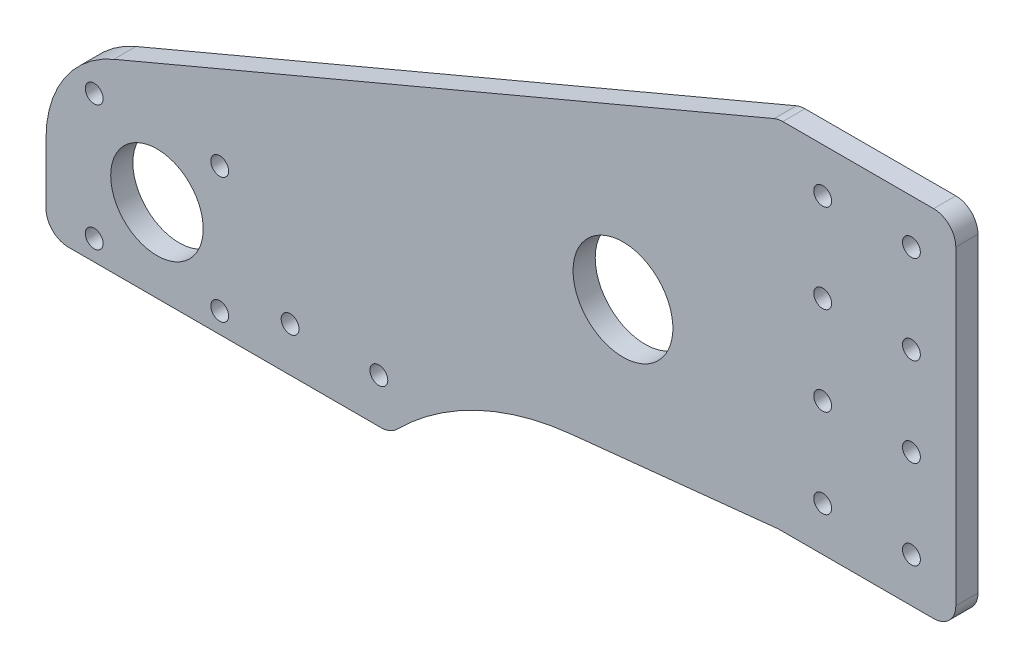
ISO-10303-21;
HEADER;
FILE_DESCRIPTION(('STEP AP214'),'2;1');
FILE_NAME('part.step','',(''),(''),'','','');
FILE_SCHEMA(('AUTOMOTIVE_DESIGN { 1 0 10303 214 1 1 1 1 }'));
ENDSEC;
DATA;
#1=APPLICATION_CONTEXT('core data for automotive mechanical design processes');
#2=APPLICATION_PROTOCOL_DEFINITION('international standard','automotive_design',2000,#1);
#3=PRODUCT_CONTEXT('',#1,'mechanical');
#4=PRODUCT('Part','Part','',(#3));
#5=PRODUCT_RELATED_PRODUCT_CATEGORY('part','',(#4));
#6=PRODUCT_DEFINITION_FORMATION('','',#4);
#7=PRODUCT_DEFINITION_CONTEXT('part definition',#1,'design');
#8=PRODUCT_DEFINITION('design','',#6,#7);
#9=PRODUCT_DEFINITION_SHAPE('','',#8);
#10=(LENGTH_UNIT() NAMED_UNIT(*) SI_UNIT(.MILLI.,.METRE.));
#11=(NAMED_UNIT(*) PLANE_ANGLE_UNIT() SI_UNIT($,.RADIAN.));
#12=(NAMED_UNIT(*) SI_UNIT($,.STERADIAN.) SOLID_ANGLE_UNIT());
#13=UNCERTAINTY_MEASURE_WITH_UNIT(LENGTH_MEASURE(1.E-05),#10,'distance_accuracy_value','');
#14=(GEOMETRIC_REPRESENTATION_CONTEXT(3) GLOBAL_UNCERTAINTY_ASSIGNED_CONTEXT((#13)) GLOBAL_UNIT_ASSIGNED_CONTEXT((#10,
#11,#12)) REPRESENTATION_CONTEXT('',''));
#15=CARTESIAN_POINT('',(0.,0.,0.));
#16=DIRECTION('',(0.,0.,1.));
#17=DIRECTION('',(1.,0.,0.));
#18=AXIS2_PLACEMENT_3D('',#15,#16,#17);
#19=CARTESIAN_POINT('',(-50.7999999999977,44.450000000004,-6.35));
#20=DIRECTION('',(0.,0.,1.));
#21=DIRECTION('',(1.,0.,0.));
#22=AXIS2_PLACEMENT_3D('',#19,#20,#21);
#23=CYLINDRICAL_SURFACE('',#22,6.35);
#24=CARTESIAN_POINT('',(-50.7999999999977,44.450000000004,-6.35));
#25=DIRECTION('',(0.,0.,-1.));
#26=DIRECTION('',(-1.,0.,0.));
#27=AXIS2_PLACEMENT_3D('',#24,#25,#26);
#28=CIRCLE('',#27,6.35);
#29=CARTESIAN_POINT('',(-50.7999999999977,38.100000000004,-6.35));
#30=VERTEX_POINT('',#29);
#31=CARTESIAN_POINT('',(-57.1499999999977,44.450000000004,-6.35));
#32=VERTEX_POINT('',#31);
#33=EDGE_CURVE('E273',#30,#32,#28,.T.);
#34=ORIENTED_EDGE('',*,*,#33,.F.);
#35=DIRECTION('',(0.,0.,-1.));
#36=VECTOR('',#35,1.);
#37=CARTESIAN_POINT('',(-50.7999999999977,38.100000000004,-6.35));
#38=LINE('',#37,#36);
#39=CARTESIAN_POINT('',(-50.7999999999977,38.100000000004,0.));
#40=VERTEX_POINT('',#39);
#41=EDGE_CURVE('E403',#40,#30,#38,.T.);
#42=ORIENTED_EDGE('',*,*,#41,.F.);
#43=CARTESIAN_POINT('',(-50.7999999999977,44.450000000004,0.));
#44=DIRECTION('',(0.,0.,1.));
#45=DIRECTION('',(-1.,0.,0.));
#46=AXIS2_PLACEMENT_3D('',#43,#44,#45);
#47=CIRCLE('',#46,6.35);
#48=CARTESIAN_POINT('',(-57.1499999999977,44.450000000004,0.));
#49=VERTEX_POINT('',#48);
#50=EDGE_CURVE('E291',#49,#40,#47,.T.);
#51=ORIENTED_EDGE('',*,*,#50,.F.);
#52=DIRECTION('',(0.,0.,1.));
#53=VECTOR('',#52,1.);
#54=CARTESIAN_POINT('',(-57.1499999999977,44.450000000004,-6.35));
#55=LINE('',#54,#53);
#56=EDGE_CURVE('E406',#32,#49,#55,.T.);
#57=ORIENTED_EDGE('',*,*,#56,.F.);
#58=EDGE_LOOP('',(#34,#42,#51,#57));
#59=FACE_BOUND('',#58,.T.);
#60=ADVANCED_FACE('F17',(#59),#23,.T.);
#61=CARTESIAN_POINT('',(38.7414144686771,44.4500000000039,-6.35));
#62=DIRECTION('',(0.,0.,1.));
#63=DIRECTION('',(1.,0.,0.));
#64=AXIS2_PLACEMENT_3D('',#61,#62,#63);
#65=CYLINDRICAL_SURFACE('',#64,6.35);
#66=CARTESIAN_POINT('',(38.7414144686771,44.4500000000039,-6.35));
#67=DIRECTION('',(0.,0.,-1.));
#68=DIRECTION('',(-1.,0.,0.));
#69=AXIS2_PLACEMENT_3D('',#66,#67,#68);
#70=CIRCLE('',#69,6.35);
#71=CARTESIAN_POINT('',(43.2313134352007,39.9596428571464,-6.35));
#72=VERTEX_POINT('',#71);
#73=CARTESIAN_POINT('',(38.7414144686771,38.1000000000039,-6.35));
#74=VERTEX_POINT('',#73);
#75=EDGE_CURVE('E269',#72,#74,#70,.T.);
#76=ORIENTED_EDGE('',*,*,#75,.F.);
#77=DIRECTION('',(0.,0.,-1.));
#78=VECTOR('',#77,1.);
#79=CARTESIAN_POINT('',(43.2313134352007,39.9596428571464,-6.35));
#80=LINE('',#79,#78);
#81=CARTESIAN_POINT('',(43.2313134352007,39.9596428571464,0.));
#82=VERTEX_POINT('',#81);
#83=EDGE_CURVE('E468',#82,#72,#80,.T.);
#84=ORIENTED_EDGE('',*,*,#83,.F.);
#85=CARTESIAN_POINT('',(38.7414144686771,44.4500000000039,0.));
#86=DIRECTION('',(0.,0.,1.));
#87=DIRECTION('',(-1.,0.,0.));
#88=AXIS2_PLACEMENT_3D('',#85,#86,#87);
#89=CIRCLE('',#88,6.35);
#90=CARTESIAN_POINT('',(38.7414144686771,38.1000000000039,0.));
#91=VERTEX_POINT('',#90);
#92=EDGE_CURVE('E298',#91,#82,#89,.T.);
#93=ORIENTED_EDGE('',*,*,#92,.F.);
#94=DIRECTION('',(0.,0.,1.));
#95=VECTOR('',#94,1.);
#96=CARTESIAN_POINT('',(38.7414144686771,38.1000000000039,0.));
#97=LINE('',#96,#95);
#98=EDGE_CURVE('E431',#74,#91,#97,.T.);
#99=ORIENTED_EDGE('',*,*,#98,.F.);
#100=EDGE_LOOP('',(#76,#84,#93,#99));
#101=FACE_BOUND('',#100,.T.);
#102=ADVANCED_FACE('F389',(#101),#65,.T.);
#103=CARTESIAN_POINT('',(152.728599018071,63.5,-6.35));
#104=DIRECTION('',(0.,0.,-1.));
#105=DIRECTION('',(-1.,0.,0.));
#106=AXIS2_PLACEMENT_3D('',#103,#104,#105);
#107=CYLINDRICAL_SURFACE('',#106,6.35);
#108=CARTESIAN_POINT('',(152.728599018071,63.5,-6.35));
#109=DIRECTION('',(0.,0.,1.));
#110=DIRECTION('',(-1.,0.,0.));
#111=AXIS2_PLACEMENT_3D('',#108,#109,#110);
#112=CIRCLE('',#111,6.35);
#113=CARTESIAN_POINT('',(152.728599018071,69.85,-6.35));
#114=VERTEX_POINT('',#113);
#115=CARTESIAN_POINT('',(152.073156154869,69.8160822234262,-6.35));
#116=VERTEX_POINT('',#115);
#117=EDGE_CURVE('E274',#114,#116,#112,.T.);
#118=ORIENTED_EDGE('',*,*,#117,.F.);
#119=DIRECTION('',(0.,0.,-1.));
#120=VECTOR('',#119,1.);
#121=CARTESIAN_POINT('',(152.728599018071,69.85,-6.35));
#122=LINE('',#121,#120);
#123=CARTESIAN_POINT('',(152.728599018071,69.85,0.));
#124=VERTEX_POINT('',#123);
#125=EDGE_CURVE('E527',#124,#114,#122,.T.);
#126=ORIENTED_EDGE('',*,*,#125,.F.);
#127=CARTESIAN_POINT('',(152.728599018071,63.5,0.));
#128=DIRECTION('',(0.,0.,-1.));
#129=DIRECTION('',(-1.,0.,0.));
#130=AXIS2_PLACEMENT_3D('',#127,#128,#129);
#131=CIRCLE('',#130,6.35);
#132=CARTESIAN_POINT('',(152.073156154869,69.8160822234262,0.));
#133=VERTEX_POINT('',#132);
#134=EDGE_CURVE('E20',#133,#124,#131,.T.);
#135=ORIENTED_EDGE('',*,*,#134,.F.);
#136=DIRECTION('',(0.,0.,1.));
#137=VECTOR('',#136,1.);
#138=CARTESIAN_POINT('',(152.073156154869,69.8160822234262,0.));
#139=LINE('',#138,#137);
#140=EDGE_CURVE('E438',#116,#133,#139,.T.);
#141=ORIENTED_EDGE('',*,*,#140,.F.);
#142=EDGE_LOOP('',(#118,#126,#135,#141));
#143=FACE_BOUND('',#142,.T.);
#144=ADVANCED_FACE('F394',(#143),#107,.F.);
#145=CARTESIAN_POINT('',(153.685641644431,165.1,-6.35));
#146=DIRECTION('',(0.,0.,1.));
#147=DIRECTION('',(1.,0.,0.));
#148=AXIS2_PLACEMENT_3D('',#145,#146,#147);
#149=CYLINDRICAL_SURFACE('',#148,6.35);
#150=CARTESIAN_POINT('',(153.685641644431,165.1,-6.35));
#151=DIRECTION('',(0.,0.,-1.));
#152=DIRECTION('',(-1.,0.,0.));
#153=AXIS2_PLACEMENT_3D('',#150,#151,#152);
#154=CIRCLE('',#153,6.35);
#155=CARTESIAN_POINT('',(151.215608397485,170.949909038522,-6.35));
#156=VERTEX_POINT('',#155);
#157=CARTESIAN_POINT('',(153.685641644431,171.45,-6.35));
#158=VERTEX_POINT('',#157);
#159=EDGE_CURVE('E278',#156,#158,#154,.T.);
#160=ORIENTED_EDGE('',*,*,#159,.F.);
#161=DIRECTION('',(0.,0.,-1.));
#162=VECTOR('',#161,1.);
#163=CARTESIAN_POINT('',(151.215608397485,170.949909038522,-6.35));
#164=LINE('',#163,#162);
#165=CARTESIAN_POINT('',(151.215608397485,170.949909038522,0.));
#166=VERTEX_POINT('',#165);
#167=EDGE_CURVE('E477',#166,#156,#164,.T.);
#168=ORIENTED_EDGE('',*,*,#167,.F.);
#169=CARTESIAN_POINT('',(153.685641644431,165.1,0.));
#170=DIRECTION('',(0.,0.,1.));
#171=DIRECTION('',(-1.,0.,0.));
#172=AXIS2_PLACEMENT_3D('',#169,#170,#171);
#173=CIRCLE('',#172,6.35);
#174=CARTESIAN_POINT('',(153.685641644431,171.45,0.));
#175=VERTEX_POINT('',#174);
#176=EDGE_CURVE('E283',#175,#166,#173,.T.);
#177=ORIENTED_EDGE('',*,*,#176,.F.);
#178=DIRECTION('',(0.,0.,1.));
#179=VECTOR('',#178,1.);
#180=CARTESIAN_POINT('',(153.685641644431,171.45,-6.35));
#181=LINE('',#180,#179);
#182=EDGE_CURVE('E452',#158,#175,#181,.T.);
#183=ORIENTED_EDGE('',*,*,#182,.F.);
#184=EDGE_LOOP('',(#160,#168,#177,#183));
#185=FACE_BOUND('',#184,.T.);
#186=ADVANCED_FACE('F872',(#185),#149,.T.);
#187=CARTESIAN_POINT('',(196.850000000007,76.2,-6.35));
#188=DIRECTION('',(0.,0.,1.));
#189=DIRECTION('',(1.,0.,0.));
#190=AXIS2_PLACEMENT_3D('',#187,#188,#189);
#191=CYLINDRICAL_SURFACE('',#190,6.35);
#192=CARTESIAN_POINT('',(196.850000000007,76.2,-6.35));
#193=DIRECTION('',(0.,0.,-1.));
#194=DIRECTION('',(-1.,0.,0.));
#195=AXIS2_PLACEMENT_3D('',#192,#193,#194);
#196=CIRCLE('',#195,6.35);
#197=CARTESIAN_POINT('',(203.200000000007,76.2,-6.35));
#198=VERTEX_POINT('',#197);
#199=CARTESIAN_POINT('',(196.850000000007,69.85,-6.35));
#200=VERTEX_POINT('',#199);
#201=EDGE_CURVE('E268',#198,#200,#196,.T.);
#202=ORIENTED_EDGE('',*,*,#201,.F.);
#203=DIRECTION('',(0.,0.,-1.));
#204=VECTOR('',#203,1.);
#205=CARTESIAN_POINT('',(203.200000000007,76.2,-6.35));
#206=LINE('',#205,#204);
#207=CARTESIAN_POINT('',(203.200000000007,76.2,0.));
#208=VERTEX_POINT('',#207);
#209=EDGE_CURVE('E531',#208,#198,#206,.T.);
#210=ORIENTED_EDGE('',*,*,#209,.F.);
#211=CARTESIAN_POINT('',(196.850000000007,76.2,0.));
#212=DIRECTION('',(0.,0.,1.));
#213=DIRECTION('',(-1.,0.,0.));
#214=AXIS2_PLACEMENT_3D('',#211,#212,#213);
#215=CIRCLE('',#214,6.35);
#216=CARTESIAN_POINT('',(196.850000000007,69.85,0.));
#217=VERTEX_POINT('',#216);
#218=EDGE_CURVE('E11',#217,#208,#215,.T.);
#219=ORIENTED_EDGE('',*,*,#218,.F.);
#220=DIRECTION('',(0.,0.,1.));
#221=VECTOR('',#220,1.);
#222=CARTESIAN_POINT('',(196.850000000007,69.85,-6.35));
#223=LINE('',#222,#221);
#224=EDGE_CURVE('E541',#200,#217,#223,.T.);
#225=ORIENTED_EDGE('',*,*,#224,.F.);
#226=EDGE_LOOP('',(#202,#210,#219,#225));
#227=FACE_BOUND('',#226,.T.);
#228=ADVANCED_FACE('F864',(#227),#191,.T.);
#229=CARTESIAN_POINT('',(196.850000000007,165.1,-6.35));
#230=DIRECTION('',(0.,0.,-1.));
#231=DIRECTION('',(-1.,0.,0.));
#232=AXIS2_PLACEMENT_3D('',#229,#230,#231);
#233=CYLINDRICAL_SURFACE('',#232,6.35);
#234=CARTESIAN_POINT('',(196.850000000007,165.1,-6.35));
#235=DIRECTION('',(0.,0.,-1.));
#236=DIRECTION('',(-1.,0.,0.));
#237=AXIS2_PLACEMENT_3D('',#234,#235,#236);
#238=CIRCLE('',#237,6.35);
#239=CARTESIAN_POINT('',(196.850000000007,171.45,-6.35));
#240=VERTEX_POINT('',#239);
#241=CARTESIAN_POINT('',(203.200000000007,165.1,-6.35));
#242=VERTEX_POINT('',#241);
#243=EDGE_CURVE('E265',#240,#242,#238,.T.);
#244=ORIENTED_EDGE('',*,*,#243,.F.);
#245=DIRECTION('',(0.,0.,-1.));
#246=VECTOR('',#245,1.);
#247=CARTESIAN_POINT('',(196.850000000007,171.45,-6.35));
#248=LINE('',#247,#246);
#249=CARTESIAN_POINT('',(196.850000000007,171.45,0.));
#250=VERTEX_POINT('',#249);
#251=EDGE_CURVE('E463',#250,#240,#248,.T.);
#252=ORIENTED_EDGE('',*,*,#251,.F.);
#253=CARTESIAN_POINT('',(196.850000000007,165.1,0.));
#254=DIRECTION('',(0.,0.,1.));
#255=DIRECTION('',(-1.,0.,0.));
#256=AXIS2_PLACEMENT_3D('',#253,#254,#255);
#257=CIRCLE('',#256,6.35);
#258=CARTESIAN_POINT('',(203.200000000007,165.1,0.));
#259=VERTEX_POINT('',#258);
#260=EDGE_CURVE('E280',#259,#250,#257,.T.);
#261=ORIENTED_EDGE('',*,*,#260,.F.);
#262=DIRECTION('',(0.,0.,1.));
#263=VECTOR('',#262,1.);
#264=CARTESIAN_POINT('',(203.200000000007,165.1,0.));
#265=LINE('',#264,#263);
#266=EDGE_CURVE('E517',#242,#259,#265,.T.);
#267=ORIENTED_EDGE('',*,*,#266,.F.);
#268=EDGE_LOOP('',(#244,#252,#261,#267));
#269=FACE_BOUND('',#268,.T.);
#270=ADVANCED_FACE('F862',(#269),#233,.T.);
#271=CARTESIAN_POINT('',(-25.3999999999828,422.5925,0.));
#272=DIRECTION('',(0.,0.,-1.));
#273=DIRECTION('',(0.,-1.,0.));
#274=AXIS2_PLACEMENT_3D('',#271,#272,#273);
#275=PLANE('',#274);
#276=CARTESIAN_POINT('',(38.1,50.8,0.));
#277=DIRECTION('',(0.,0.,1.));
#278=DIRECTION('',(1.,0.,0.));
#279=AXIS2_PLACEMENT_3D('',#276,#277,#278);
#280=CIRCLE('',#279,2.5527);
#281=CARTESIAN_POINT('',(40.6527,50.8,0.));
#282=VERTEX_POINT('',#281);
#283=EDGE_CURVE('E37',#282,#282,#280,.T.);
#284=ORIENTED_EDGE('',*,*,#283,.F.);
#285=EDGE_LOOP('',(#284));
#286=FACE_BOUND('',#285,.T.);
#287=CARTESIAN_POINT('',(12.7,50.8,0.));
#288=DIRECTION('',(0.,0.,1.));
#289=DIRECTION('',(1.,0.,0.));
#290=AXIS2_PLACEMENT_3D('',#287,#288,#289);
#291=CIRCLE('',#290,2.5527);
#292=CARTESIAN_POINT('',(15.2527,50.8,0.));
#293=VERTEX_POINT('',#292);
#294=EDGE_CURVE('E564',#293,#293,#291,.T.);
#295=ORIENTED_EDGE('',*,*,#294,.F.);
#296=EDGE_LOOP('',(#295));
#297=FACE_BOUND('',#296,.T.);
#298=DIRECTION('',(0.,-1.,0.));
#299=VECTOR('',#298,1.);
#300=CARTESIAN_POINT('',(203.200000000007,120.649999999997,0.));
#301=LINE('',#300,#299);
#302=EDGE_CURVE('E521',#259,#208,#301,.T.);
#303=ORIENTED_EDGE('',*,*,#302,.F.);
#304=ORIENTED_EDGE('',*,*,#260,.T.);
#305=DIRECTION('',(-1.,0.,0.));
#306=VECTOR('',#305,1.);
#307=CARTESIAN_POINT('',(177.800000000007,171.45,0.));
#308=LINE('',#307,#306);
#309=EDGE_CURVE('E466',#250,#175,#308,.T.);
#310=ORIENTED_EDGE('',*,*,#309,.T.);
#311=ORIENTED_EDGE('',*,*,#176,.T.);
#312=DIRECTION('',(-0.921245517877459,-0.388981613692335,0.));
#313=VECTOR('',#312,1.);
#314=CARTESIAN_POINT('',(57.3249168826388,131.306022596307,0.));
#315=LINE('',#314,#313);
#316=CARTESIAN_POINT('',(-37.7501662347294,91.162045192613,0.));
#317=VERTEX_POINT('',#316);
#318=EDGE_CURVE('E486',#166,#317,#315,.T.);
#319=ORIENTED_EDGE('',*,*,#318,.T.);
#320=CARTESIAN_POINT('',(-25.3999999999978,61.9125000000037,0.));
#321=DIRECTION('',(0.,0.,-1.));
#322=DIRECTION('',(-1.,0.,0.));
#323=AXIS2_PLACEMENT_3D('',#320,#321,#322);
#324=CIRCLE('',#323,31.75);
#325=CARTESIAN_POINT('',(-57.1499999999977,61.9125000000037,0.));
#326=VERTEX_POINT('',#325);
#327=EDGE_CURVE('E448',#326,#317,#324,.T.);
#328=ORIENTED_EDGE('',*,*,#327,.F.);
#329=DIRECTION('',(0.,1.,0.));
#330=VECTOR('',#329,1.);
#331=CARTESIAN_POINT('',(-57.1499999999977,50.0062500000038,0.));
#332=LINE('',#331,#330);
#333=EDGE_CURVE('E462',#49,#326,#332,.T.);
#334=ORIENTED_EDGE('',*,*,#333,.F.);
#335=ORIENTED_EDGE('',*,*,#50,.T.);
#336=DIRECTION('',(-1.,0.,0.));
#337=VECTOR('',#336,1.);
#338=CARTESIAN_POINT('',(-25.3999999999978,38.1000000000039,0.));
#339=LINE('',#338,#337);
#340=EDGE_CURVE('E421',#91,#40,#339,.T.);
#341=ORIENTED_EDGE('',*,*,#340,.F.);
#342=ORIENTED_EDGE('',*,*,#92,.T.);
#343=CARTESIAN_POINT('',(101.600000000007,-18.415,0.));
#344=DIRECTION('',(0.,0.,-1.));
#345=DIRECTION('',(-1.,0.,0.));
#346=AXIS2_PLACEMENT_3D('',#343,#344,#345);
#347=CIRCLE('',#346,82.55);
#348=CARTESIAN_POINT('',(93.079242778374,63.694068904537,0.));
#349=VERTEX_POINT('',#348);
#350=EDGE_CURVE('E473',#82,#349,#347,.T.);
#351=ORIENTED_EDGE('',*,*,#350,.T.);
#352=DIRECTION('',(-0.994658617862349,-0.103219348535834,0.));
#353=VECTOR('',#352,1.);
#354=CARTESIAN_POINT('',(122.73962138919,66.7720344522686,0.));
#355=LINE('',#354,#353);
#356=EDGE_CURVE('E442',#133,#349,#355,.T.);
#357=ORIENTED_EDGE('',*,*,#356,.F.);
#358=ORIENTED_EDGE('',*,*,#134,.T.);
#359=DIRECTION('',(-1.,0.,0.));
#360=VECTOR('',#359,1.);
#361=CARTESIAN_POINT('',(177.800000000007,69.85,0.));
#362=LINE('',#361,#360);
#363=EDGE_CURVE('E545',#217,#124,#362,.T.);
#364=ORIENTED_EDGE('',*,*,#363,.F.);
#365=ORIENTED_EDGE('',*,*,#218,.T.);
#366=EDGE_LOOP('',(#303,#304,#310,#311,#319,#328,#334,#335,#341,#342,#351,#357,#358,#364,#365));
#367=FACE_BOUND('',#366,.T.);
#368=CARTESIAN_POINT('',(-7.43948775785944,79.873012242142,0.));
#369=DIRECTION('',(0.,0.,-1.));
#370=DIRECTION('',(-1.,0.,0.));
#371=AXIS2_PLACEMENT_3D('',#368,#369,#370);
#372=CIRCLE('',#371,2.5527);
#373=CARTESIAN_POINT('',(-9.99218775785944,79.873012242142,0.));
#374=VERTEX_POINT('',#373);
#375=EDGE_CURVE('E499',#374,#374,#372,.T.);
#376=ORIENTED_EDGE('',*,*,#375,.T.);
#377=EDGE_LOOP('',(#376));
#378=FACE_BOUND('',#377,.T.);
#379=CARTESIAN_POINT('',(-43.3605122421361,79.873012242142,0.));
#380=DIRECTION('',(0.,0.,-1.));
#381=DIRECTION('',(-1.,0.,0.));
#382=AXIS2_PLACEMENT_3D('',#379,#380,#381);
#383=CIRCLE('',#382,2.5527);
#384=CARTESIAN_POINT('',(-45.913212242136,79.873012242142,0.));
#385=VERTEX_POINT('',#384);
#386=EDGE_CURVE('E308',#385,#385,#383,.T.);
#387=ORIENTED_EDGE('',*,*,#386,.T.);
#388=EDGE_LOOP('',(#387));
#389=FACE_BOUND('',#388,.T.);
#390=CARTESIAN_POINT('',(-43.3605122421361,43.9519877578654,0.));
#391=DIRECTION('',(0.,0.,-1.));
#392=DIRECTION('',(-1.,0.,0.));
#393=AXIS2_PLACEMENT_3D('',#390,#391,#392);
#394=CIRCLE('',#393,2.5527);
#395=CARTESIAN_POINT('',(-45.913212242136,43.9519877578654,0.));
#396=VERTEX_POINT('',#395);
#397=EDGE_CURVE('E307',#396,#396,#394,.T.);
#398=ORIENTED_EDGE('',*,*,#397,.T.);
#399=EDGE_LOOP('',(#398));
#400=FACE_BOUND('',#399,.T.);
#401=CARTESIAN_POINT('',(-7.43948775785944,43.9519877578654,0.));
#402=DIRECTION('',(0.,0.,-1.));
#403=DIRECTION('',(-1.,0.,0.));
#404=AXIS2_PLACEMENT_3D('',#401,#402,#403);
#405=CIRCLE('',#404,2.5527);
#406=CARTESIAN_POINT('',(-9.99218775785944,43.9519877578654,0.));
#407=VERTEX_POINT('',#406);
#408=EDGE_CURVE('E314',#407,#407,#405,.T.);
#409=ORIENTED_EDGE('',*,*,#408,.T.);
#410=EDGE_LOOP('',(#409));
#411=FACE_BOUND('',#410,.T.);
#412=CARTESIAN_POINT('',(190.500000000007,82.55,0.));
#413=DIRECTION('',(0.,0.,-1.));
#414=DIRECTION('',(-1.,0.,0.));
#415=AXIS2_PLACEMENT_3D('',#412,#413,#414);
#416=CIRCLE('',#415,2.5527);
#417=CARTESIAN_POINT('',(187.947300000007,82.55,0.));
#418=VERTEX_POINT('',#417);
#419=EDGE_CURVE('E321',#418,#418,#416,.T.);
#420=ORIENTED_EDGE('',*,*,#419,.T.);
#421=EDGE_LOOP('',(#420));
#422=FACE_BOUND('',#421,.T.);
#423=CARTESIAN_POINT('',(190.500000000007,107.95,0.));
#424=DIRECTION('',(0.,0.,-1.));
#425=DIRECTION('',(-1.,0.,0.));
#426=AXIS2_PLACEMENT_3D('',#423,#424,#425);
#427=CIRCLE('',#426,2.5527);
#428=CARTESIAN_POINT('',(187.947300000007,107.95,0.));
#429=VERTEX_POINT('',#428);
#430=EDGE_CURVE('E328',#429,#429,#427,.T.);
#431=ORIENTED_EDGE('',*,*,#430,.T.);
#432=EDGE_LOOP('',(#431));
#433=FACE_BOUND('',#432,.T.);
#434=CARTESIAN_POINT('',(190.500000000007,133.35,0.));
#435=DIRECTION('',(0.,0.,-1.));
#436=DIRECTION('',(-1.,0.,0.));
#437=AXIS2_PLACEMENT_3D('',#434,#435,#436);
#438=CIRCLE('',#437,2.5527);
#439=CARTESIAN_POINT('',(187.947300000007,133.35,0.));
#440=VERTEX_POINT('',#439);
#441=EDGE_CURVE('E339',#440,#440,#438,.T.);
#442=ORIENTED_EDGE('',*,*,#441,.T.);
#443=EDGE_LOOP('',(#442));
#444=FACE_BOUND('',#443,.T.);
#445=CARTESIAN_POINT('',(190.500000000007,158.75,0.));
#446=DIRECTION('',(0.,0.,-1.));
#447=DIRECTION('',(-1.,0.,0.));
#448=AXIS2_PLACEMENT_3D('',#445,#446,#447);
#449=CIRCLE('',#448,2.5527);
#450=CARTESIAN_POINT('',(187.947300000007,158.75,0.));
#451=VERTEX_POINT('',#450);
#452=EDGE_CURVE('E343',#451,#451,#449,.T.);
#453=ORIENTED_EDGE('',*,*,#452,.T.);
#454=EDGE_LOOP('',(#453));
#455=FACE_BOUND('',#454,.T.);
#456=CARTESIAN_POINT('',(165.100000000007,82.55,0.));
#457=DIRECTION('',(0.,0.,-1.));
#458=DIRECTION('',(-1.,0.,0.));
#459=AXIS2_PLACEMENT_3D('',#456,#457,#458);
#460=CIRCLE('',#459,2.5527);
#461=CARTESIAN_POINT('',(162.547300000007,82.55,0.));
#462=VERTEX_POINT('',#461);
#463=EDGE_CURVE('E347',#462,#462,#460,.T.);
#464=ORIENTED_EDGE('',*,*,#463,.T.);
#465=EDGE_LOOP('',(#464));
#466=FACE_BOUND('',#465,.T.);
#467=CARTESIAN_POINT('',(165.100000000007,107.95,0.));
#468=DIRECTION('',(0.,0.,-1.));
#469=DIRECTION('',(-1.,0.,0.));
#470=AXIS2_PLACEMENT_3D('',#467,#468,#469);
#471=CIRCLE('',#470,2.5527);
#472=CARTESIAN_POINT('',(162.547300000007,107.95,0.));
#473=VERTEX_POINT('',#472);
#474=EDGE_CURVE('E332',#473,#473,#471,.T.);
#475=ORIENTED_EDGE('',*,*,#474,.T.);
#476=EDGE_LOOP('',(#475));
#477=FACE_BOUND('',#476,.T.);
#478=CARTESIAN_POINT('',(165.100000000007,133.35,0.));
#479=DIRECTION('',(0.,0.,-1.));
#480=DIRECTION('',(-1.,0.,0.));
#481=AXIS2_PLACEMENT_3D('',#478,#479,#480);
#482=CIRCLE('',#481,2.5527);
#483=CARTESIAN_POINT('',(162.547300000007,133.35,0.));
#484=VERTEX_POINT('',#483);
#485=EDGE_CURVE('E354',#484,#484,#482,.T.);
#486=ORIENTED_EDGE('',*,*,#485,.T.);
#487=EDGE_LOOP('',(#486));
#488=FACE_BOUND('',#487,.T.);
#489=CARTESIAN_POINT('',(165.100000000007,158.75,0.));
#490=DIRECTION('',(0.,0.,-1.));
#491=DIRECTION('',(-1.,0.,0.));
#492=AXIS2_PLACEMENT_3D('',#489,#490,#491);
#493=CIRCLE('',#492,2.5527);
#494=CARTESIAN_POINT('',(162.547300000007,158.75,0.));
#495=VERTEX_POINT('',#494);
#496=EDGE_CURVE('E358',#495,#495,#493,.T.);
#497=ORIENTED_EDGE('',*,*,#496,.T.);
#498=EDGE_LOOP('',(#497));
#499=FACE_BOUND('',#498,.T.);
#500=CARTESIAN_POINT('',(107.950000000006,104.480209879193,0.));
#501=DIRECTION('',(0.,0.,-1.));
#502=DIRECTION('',(-1.,0.,0.));
#503=AXIS2_PLACEMENT_3D('',#500,#501,#502);
#504=CIRCLE('',#503,14.2875);
#505=CARTESIAN_POINT('',(93.6625000000064,104.480209879193,0.));
#506=VERTEX_POINT('',#505);
#507=EDGE_CURVE('E258',#506,#506,#504,.T.);
#508=ORIENTED_EDGE('',*,*,#507,.T.);
#509=EDGE_LOOP('',(#508));
#510=FACE_BOUND('',#509,.T.);
#511=CARTESIAN_POINT('',(-25.3999999999978,61.9125000000037,0.));
#512=DIRECTION('',(0.,0.,-1.));
#513=DIRECTION('',(-1.,0.,0.));
#514=AXIS2_PLACEMENT_3D('',#511,#512,#513);
#515=CIRCLE('',#514,13.2371542890105);
#516=CARTESIAN_POINT('',(-38.6371542890082,61.9125000000037,0.));
#517=VERTEX_POINT('',#516);
#518=EDGE_CURVE('E245',#517,#517,#515,.T.);
#519=ORIENTED_EDGE('',*,*,#518,.T.);
#520=EDGE_LOOP('',(#519));
#521=FACE_BOUND('',#520,.T.);
#522=ADVANCED_FACE('F246',(#286,#297,#367,#378,#389,#400,#411,#422,#433,#444,#455,#466,#477,
#488,#499,#510,#521),#275,.F.);
#523=CARTESIAN_POINT('',(-25.3999999999828,422.5925,-6.35));
#524=DIRECTION('',(0.,0.,-1.));
#525=DIRECTION('',(0.,-1.,0.));
#526=AXIS2_PLACEMENT_3D('',#523,#524,#525);
#527=PLANE('',#526);
#528=CARTESIAN_POINT('',(38.1,50.8,-6.35));
#529=DIRECTION('',(0.,0.,1.));
#530=DIRECTION('',(1.,0.,0.));
#531=AXIS2_PLACEMENT_3D('',#528,#529,#530);
#532=CIRCLE('',#531,2.5527);
#533=CARTESIAN_POINT('',(40.6527,50.8,-6.35));
#534=VERTEX_POINT('',#533);
#535=EDGE_CURVE('E249',#534,#534,#532,.T.);
#536=ORIENTED_EDGE('',*,*,#535,.T.);
#537=EDGE_LOOP('',(#536));
#538=FACE_BOUND('',#537,.T.);
#539=CARTESIAN_POINT('',(12.7,50.8,-6.35));
#540=DIRECTION('',(0.,0.,1.));
#541=DIRECTION('',(1.,0.,0.));
#542=AXIS2_PLACEMENT_3D('',#539,#540,#541);
#543=CIRCLE('',#542,2.5527);
#544=CARTESIAN_POINT('',(15.2527,50.8,-6.35));
#545=VERTEX_POINT('',#544);
#546=EDGE_CURVE('E561',#545,#545,#543,.T.);
#547=ORIENTED_EDGE('',*,*,#546,.T.);
#548=EDGE_LOOP('',(#547));
#549=FACE_BOUND('',#548,.T.);
#550=DIRECTION('',(-1.,0.,0.));
#551=VECTOR('',#550,1.);
#552=CARTESIAN_POINT('',(177.800000000007,171.45,-6.35));
#553=LINE('',#552,#551);
#554=EDGE_CURVE('E456',#240,#158,#553,.T.);
#555=ORIENTED_EDGE('',*,*,#554,.F.);
#556=ORIENTED_EDGE('',*,*,#243,.T.);
#557=DIRECTION('',(0.,-1.,0.));
#558=VECTOR('',#557,1.);
#559=CARTESIAN_POINT('',(203.200000000007,120.649999999997,-6.35));
#560=LINE('',#559,#558);
#561=EDGE_CURVE('E455',#242,#198,#560,.T.);
#562=ORIENTED_EDGE('',*,*,#561,.T.);
#563=ORIENTED_EDGE('',*,*,#201,.T.);
#564=DIRECTION('',(-1.,0.,0.));
#565=VECTOR('',#564,1.);
#566=CARTESIAN_POINT('',(177.800000000007,69.85,-6.35));
#567=LINE('',#566,#565);
#568=EDGE_CURVE('E535',#200,#114,#567,.T.);
#569=ORIENTED_EDGE('',*,*,#568,.T.);
#570=ORIENTED_EDGE('',*,*,#117,.T.);
#571=DIRECTION('',(-0.994658617862349,-0.103219348535834,0.));
#572=VECTOR('',#571,1.);
#573=CARTESIAN_POINT('',(122.73962138919,66.7720344522686,-6.35));
#574=LINE('',#573,#572);
#575=CARTESIAN_POINT('',(93.079242778374,63.694068904537,-6.35));
#576=VERTEX_POINT('',#575);
#577=EDGE_CURVE('E443',#116,#576,#574,.T.);
#578=ORIENTED_EDGE('',*,*,#577,.T.);
#579=CARTESIAN_POINT('',(101.600000000007,-18.415,-6.35));
#580=DIRECTION('',(0.,0.,-1.));
#581=DIRECTION('',(-1.,0.,0.));
#582=AXIS2_PLACEMENT_3D('',#579,#580,#581);
#583=CIRCLE('',#582,82.55);
#584=EDGE_CURVE('E472',#72,#576,#583,.T.);
#585=ORIENTED_EDGE('',*,*,#584,.F.);
#586=ORIENTED_EDGE('',*,*,#75,.T.);
#587=DIRECTION('',(-1.,0.,0.));
#588=VECTOR('',#587,1.);
#589=CARTESIAN_POINT('',(-25.3999999999978,38.1000000000039,-6.35));
#590=LINE('',#589,#588);
#591=EDGE_CURVE('E419',#74,#30,#590,.T.);
#592=ORIENTED_EDGE('',*,*,#591,.T.);
#593=ORIENTED_EDGE('',*,*,#33,.T.);
#594=DIRECTION('',(0.,1.,0.));
#595=VECTOR('',#594,1.);
#596=CARTESIAN_POINT('',(-57.1499999999977,50.0062500000038,-6.35));
#597=LINE('',#596,#595);
#598=CARTESIAN_POINT('',(-57.1499999999977,61.9125000000037,-6.35));
#599=VERTEX_POINT('',#598);
#600=EDGE_CURVE('E423',#32,#599,#597,.T.);
#601=ORIENTED_EDGE('',*,*,#600,.T.);
#602=CARTESIAN_POINT('',(-25.3999999999978,61.9125000000037,-6.35));
#603=DIRECTION('',(0.,0.,-1.));
#604=DIRECTION('',(-1.,0.,0.));
#605=AXIS2_PLACEMENT_3D('',#602,#603,#604);
#606=CIRCLE('',#605,31.75);
#607=CARTESIAN_POINT('',(-37.7501662347294,91.162045192613,-6.35));
#608=VERTEX_POINT('',#607);
#609=EDGE_CURVE('E447',#599,#608,#606,.T.);
#610=ORIENTED_EDGE('',*,*,#609,.T.);
#611=DIRECTION('',(-0.921245517877459,-0.388981613692335,0.));
#612=VECTOR('',#611,1.);
#613=CARTESIAN_POINT('',(57.3249168826388,131.306022596307,-6.35));
#614=LINE('',#613,#612);
#615=EDGE_CURVE('E474',#156,#608,#614,.T.);
#616=ORIENTED_EDGE('',*,*,#615,.F.);
#617=ORIENTED_EDGE('',*,*,#159,.T.);
#618=EDGE_LOOP('',(#555,#556,#562,#563,#569,#570,#578,#585,#586,#592,#593,#601,#610,#616,#617));
#619=FACE_BOUND('',#618,.T.);
#620=CARTESIAN_POINT('',(-7.43948775785944,79.873012242142,-6.35));
#621=DIRECTION('',(0.,0.,-1.));
#622=DIRECTION('',(-1.,0.,0.));
#623=AXIS2_PLACEMENT_3D('',#620,#621,#622);
#624=CIRCLE('',#623,2.5527);
#625=CARTESIAN_POINT('',(-9.99218775785944,79.873012242142,-6.35));
#626=VERTEX_POINT('',#625);
#627=EDGE_CURVE('E302',#626,#626,#624,.T.);
#628=ORIENTED_EDGE('',*,*,#627,.F.);
#629=EDGE_LOOP('',(#628));
#630=FACE_BOUND('',#629,.T.);
#631=CARTESIAN_POINT('',(-43.3605122421361,79.873012242142,-6.35));
#632=DIRECTION('',(0.,0.,-1.));
#633=DIRECTION('',(-1.,0.,0.));
#634=AXIS2_PLACEMENT_3D('',#631,#632,#633);
#635=CIRCLE('',#634,2.5527);
#636=CARTESIAN_POINT('',(-45.913212242136,79.873012242142,-6.35));
#637=VERTEX_POINT('',#636);
#638=EDGE_CURVE('E502',#637,#637,#635,.T.);
#639=ORIENTED_EDGE('',*,*,#638,.F.);
#640=EDGE_LOOP('',(#639));
#641=FACE_BOUND('',#640,.T.);
#642=CARTESIAN_POINT('',(-43.3605122421361,43.9519877578654,-6.35));
#643=DIRECTION('',(0.,0.,-1.));
#644=DIRECTION('',(-1.,0.,0.));
#645=AXIS2_PLACEMENT_3D('',#642,#643,#644);
#646=CIRCLE('',#645,2.5527);
#647=CARTESIAN_POINT('',(-45.913212242136,43.9519877578654,-6.35));
#648=VERTEX_POINT('',#647);
#649=EDGE_CURVE('E304',#648,#648,#646,.T.);
#650=ORIENTED_EDGE('',*,*,#649,.F.);
#651=EDGE_LOOP('',(#650));
#652=FACE_BOUND('',#651,.T.);
#653=CARTESIAN_POINT('',(-7.43948775785944,43.9519877578654,-6.35));
#654=DIRECTION('',(0.,0.,-1.));
#655=DIRECTION('',(-1.,0.,0.));
#656=AXIS2_PLACEMENT_3D('',#653,#654,#655);
#657=CIRCLE('',#656,2.5527);
#658=CARTESIAN_POINT('',(-9.99218775785944,43.9519877578654,-6.35));
#659=VERTEX_POINT('',#658);
#660=EDGE_CURVE('E310',#659,#659,#657,.T.);
#661=ORIENTED_EDGE('',*,*,#660,.F.);
#662=EDGE_LOOP('',(#661));
#663=FACE_BOUND('',#662,.T.);
#664=CARTESIAN_POINT('',(190.500000000007,82.55,-6.35));
#665=DIRECTION('',(0.,0.,-1.));
#666=DIRECTION('',(-1.,0.,0.));
#667=AXIS2_PLACEMENT_3D('',#664,#665,#666);
#668=CIRCLE('',#667,2.5527);
#669=CARTESIAN_POINT('',(187.947300000007,82.55,-6.35));
#670=VERTEX_POINT('',#669);
#671=EDGE_CURVE('E317',#670,#670,#668,.T.);
#672=ORIENTED_EDGE('',*,*,#671,.F.);
#673=EDGE_LOOP('',(#672));
#674=FACE_BOUND('',#673,.T.);
#675=CARTESIAN_POINT('',(190.500000000007,107.95,-6.35));
#676=DIRECTION('',(0.,0.,-1.));
#677=DIRECTION('',(-1.,0.,0.));
#678=AXIS2_PLACEMENT_3D('',#675,#676,#677);
#679=CIRCLE('',#678,2.5527);
#680=CARTESIAN_POINT('',(187.947300000007,107.95,-6.35));
#681=VERTEX_POINT('',#680);
#682=EDGE_CURVE('E325',#681,#681,#679,.T.);
#683=ORIENTED_EDGE('',*,*,#682,.F.);
#684=EDGE_LOOP('',(#683));
#685=FACE_BOUND('',#684,.T.);
#686=CARTESIAN_POINT('',(190.500000000007,133.35,-6.35));
#687=DIRECTION('',(0.,0.,-1.));
#688=DIRECTION('',(-1.,0.,0.));
#689=AXIS2_PLACEMENT_3D('',#686,#687,#688);
#690=CIRCLE('',#689,2.5527);
#691=CARTESIAN_POINT('',(187.947300000007,133.35,-6.35));
#692=VERTEX_POINT('',#691);
#693=EDGE_CURVE('E331',#692,#692,#690,.T.);
#694=ORIENTED_EDGE('',*,*,#693,.F.);
#695=EDGE_LOOP('',(#694));
#696=FACE_BOUND('',#695,.T.);
#697=CARTESIAN_POINT('',(190.500000000007,158.75,-6.35));
#698=DIRECTION('',(0.,0.,-1.));
#699=DIRECTION('',(-1.,0.,0.));
#700=AXIS2_PLACEMENT_3D('',#697,#698,#699);
#701=CIRCLE('',#700,2.5527);
#702=CARTESIAN_POINT('',(187.947300000007,158.75,-6.35));
#703=VERTEX_POINT('',#702);
#704=EDGE_CURVE('E340',#703,#703,#701,.T.);
#705=ORIENTED_EDGE('',*,*,#704,.F.);
#706=EDGE_LOOP('',(#705));
#707=FACE_BOUND('',#706,.T.);
#708=CARTESIAN_POINT('',(165.100000000007,82.55,-6.35));
#709=DIRECTION('',(0.,0.,-1.));
#710=DIRECTION('',(-1.,0.,0.));
#711=AXIS2_PLACEMENT_3D('',#708,#709,#710);
#712=CIRCLE('',#711,2.5527);
#713=CARTESIAN_POINT('',(162.547300000007,82.55,-6.35));
#714=VERTEX_POINT('',#713);
#715=EDGE_CURVE('E346',#714,#714,#712,.T.);
#716=ORIENTED_EDGE('',*,*,#715,.F.);
#717=EDGE_LOOP('',(#716));
#718=FACE_BOUND('',#717,.T.);
#719=CARTESIAN_POINT('',(165.100000000007,107.95,-6.35));
#720=DIRECTION('',(0.,0.,-1.));
#721=DIRECTION('',(-1.,0.,0.));
#722=AXIS2_PLACEMENT_3D('',#719,#720,#721);
#723=CIRCLE('',#722,2.5527);
#724=CARTESIAN_POINT('',(162.547300000007,107.95,-6.35));
#725=VERTEX_POINT('',#724);
#726=EDGE_CURVE('E336',#725,#725,#723,.T.);
#727=ORIENTED_EDGE('',*,*,#726,.F.);
#728=EDGE_LOOP('',(#727));
#729=FACE_BOUND('',#728,.T.);
#730=CARTESIAN_POINT('',(165.100000000007,133.35,-6.35));
#731=DIRECTION('',(0.,0.,-1.));
#732=DIRECTION('',(-1.,0.,0.));
#733=AXIS2_PLACEMENT_3D('',#730,#731,#732);
#734=CIRCLE('',#733,2.5527);
#735=CARTESIAN_POINT('',(162.547300000007,133.35,-6.35));
#736=VERTEX_POINT('',#735);
#737=EDGE_CURVE('E335',#736,#736,#734,.T.);
#738=ORIENTED_EDGE('',*,*,#737,.F.);
#739=EDGE_LOOP('',(#738));
#740=FACE_BOUND('',#739,.T.);
#741=CARTESIAN_POINT('',(165.100000000007,158.75,-6.35));
#742=DIRECTION('',(0.,0.,-1.));
#743=DIRECTION('',(-1.,0.,0.));
#744=AXIS2_PLACEMENT_3D('',#741,#742,#743);
#745=CIRCLE('',#744,2.5527);
#746=CARTESIAN_POINT('',(162.547300000007,158.75,-6.35));
#747=VERTEX_POINT('',#746);
#748=EDGE_CURVE('E355',#747,#747,#745,.T.);
#749=ORIENTED_EDGE('',*,*,#748,.F.);
#750=EDGE_LOOP('',(#749));
#751=FACE_BOUND('',#750,.T.);
#752=CARTESIAN_POINT('',(107.950000000006,104.480209879193,-6.35));
#753=DIRECTION('',(0.,0.,-1.));
#754=DIRECTION('',(-1.,0.,0.));
#755=AXIS2_PLACEMENT_3D('',#752,#753,#754);
#756=CIRCLE('',#755,14.2875);
#757=CARTESIAN_POINT('',(93.6625000000064,104.480209879193,-6.35));
#758=VERTEX_POINT('',#757);
#759=EDGE_CURVE('E360',#758,#758,#756,.T.);
#760=ORIENTED_EDGE('',*,*,#759,.F.);
#761=EDGE_LOOP('',(#760));
#762=FACE_BOUND('',#761,.T.);
#763=CARTESIAN_POINT('',(-25.3999999999978,61.9125000000037,-6.35));
#764=DIRECTION('',(0.,0.,-1.));
#765=DIRECTION('',(-1.,0.,0.));
#766=AXIS2_PLACEMENT_3D('',#763,#764,#765);
#767=CIRCLE('',#766,13.2371542890105);
#768=CARTESIAN_POINT('',(-38.6371542890082,61.9125000000037,-6.35));
#769=VERTEX_POINT('',#768);
#770=EDGE_CURVE('E250',#769,#769,#767,.T.);
#771=ORIENTED_EDGE('',*,*,#770,.F.);
#772=EDGE_LOOP('',(#771));
#773=FACE_BOUND('',#772,.T.);
#774=ADVANCED_FACE('F426',(#538,#549,#619,#630,#641,#652,#663,#674,#685,#696,#707,#718,#729,
#740,#751,#762,#773),#527,.T.);
#775=CARTESIAN_POINT('',(38.1,50.8,-6.35));
#776=DIRECTION('',(0.,0.,1.));
#777=DIRECTION('',(1.,0.,0.));
#778=AXIS2_PLACEMENT_3D('',#775,#776,#777);
#779=CYLINDRICAL_SURFACE('',#778,2.5527);
#780=ORIENTED_EDGE('',*,*,#283,.T.);
#781=EDGE_LOOP('',(#780));
#782=FACE_BOUND('',#781,.T.);
#783=ORIENTED_EDGE('',*,*,#535,.F.);
#784=EDGE_LOOP('',(#783));
#785=FACE_BOUND('',#784,.T.);
#786=ADVANCED_FACE('F385',(#782,#785),#779,.F.);
#787=CARTESIAN_POINT('',(-25.3999999999978,61.9125000000037,-6.35));
#788=DIRECTION('',(0.,0.,1.));
#789=DIRECTION('',(1.,0.,0.));
#790=AXIS2_PLACEMENT_3D('',#787,#788,#789);
#791=CYLINDRICAL_SURFACE('',#790,13.2371542890105);
#792=ORIENTED_EDGE('',*,*,#518,.F.);
#793=EDGE_LOOP('',(#792));
#794=FACE_BOUND('',#793,.T.);
#795=ORIENTED_EDGE('',*,*,#770,.T.);
#796=EDGE_LOOP('',(#795));
#797=FACE_BOUND('',#796,.T.);
#798=ADVANCED_FACE('F375',(#794,#797),#791,.F.);
#799=CARTESIAN_POINT('',(107.950000000006,104.480209879193,-6.35));
#800=DIRECTION('',(0.,0.,1.));
#801=DIRECTION('',(1.,0.,0.));
#802=AXIS2_PLACEMENT_3D('',#799,#800,#801);
#803=CYLINDRICAL_SURFACE('',#802,14.2875);
#804=ORIENTED_EDGE('',*,*,#507,.F.);
#805=EDGE_LOOP('',(#804));
#806=FACE_BOUND('',#805,.T.);
#807=ORIENTED_EDGE('',*,*,#759,.T.);
#808=EDGE_LOOP('',(#807));
#809=FACE_BOUND('',#808,.T.);
#810=ADVANCED_FACE('F372',(#806,#809),#803,.F.);
#811=CARTESIAN_POINT('',(165.100000000007,158.75,-6.35));
#812=DIRECTION('',(0.,0.,1.));
#813=DIRECTION('',(1.,0.,0.));
#814=AXIS2_PLACEMENT_3D('',#811,#812,#813);
#815=CYLINDRICAL_SURFACE('',#814,2.5527);
#816=ORIENTED_EDGE('',*,*,#496,.F.);
#817=EDGE_LOOP('',(#816));
#818=FACE_BOUND('',#817,.T.);
#819=ORIENTED_EDGE('',*,*,#748,.T.);
#820=EDGE_LOOP('',(#819));
#821=FACE_BOUND('',#820,.T.);
#822=ADVANCED_FACE('F374',(#818,#821),#815,.F.);
#823=CARTESIAN_POINT('',(165.100000000007,133.35,-6.35));
#824=DIRECTION('',(0.,0.,1.));
#825=DIRECTION('',(1.,0.,0.));
#826=AXIS2_PLACEMENT_3D('',#823,#824,#825);
#827=CYLINDRICAL_SURFACE('',#826,2.5527);
#828=ORIENTED_EDGE('',*,*,#485,.F.);
#829=EDGE_LOOP('',(#828));
#830=FACE_BOUND('',#829,.T.);
#831=ORIENTED_EDGE('',*,*,#737,.T.);
#832=EDGE_LOOP('',(#831));
#833=FACE_BOUND('',#832,.T.);
#834=ADVANCED_FACE('F382',(#830,#833),#827,.F.);
#835=CARTESIAN_POINT('',(165.100000000007,107.95,-6.35));
#836=DIRECTION('',(0.,0.,1.));
#837=DIRECTION('',(1.,0.,0.));
#838=AXIS2_PLACEMENT_3D('',#835,#836,#837);
#839=CYLINDRICAL_SURFACE('',#838,2.5527);
#840=ORIENTED_EDGE('',*,*,#474,.F.);
#841=EDGE_LOOP('',(#840));
#842=FACE_BOUND('',#841,.T.);
#843=ORIENTED_EDGE('',*,*,#726,.T.);
#844=EDGE_LOOP('',(#843));
#845=FACE_BOUND('',#844,.T.);
#846=ADVANCED_FACE('F845',(#842,#845),#839,.F.);
#847=CARTESIAN_POINT('',(165.100000000007,82.55,-6.35));
#848=DIRECTION('',(0.,0.,1.));
#849=DIRECTION('',(1.,0.,0.));
#850=AXIS2_PLACEMENT_3D('',#847,#848,#849);
#851=CYLINDRICAL_SURFACE('',#850,2.5527);
#852=ORIENTED_EDGE('',*,*,#463,.F.);
#853=EDGE_LOOP('',(#852));
#854=FACE_BOUND('',#853,.T.);
#855=ORIENTED_EDGE('',*,*,#715,.T.);
#856=EDGE_LOOP('',(#855));
#857=FACE_BOUND('',#856,.T.);
#858=ADVANCED_FACE('F851',(#854,#857),#851,.F.);
#859=CARTESIAN_POINT('',(190.500000000007,158.75,-6.35));
#860=DIRECTION('',(0.,0.,1.));
#861=DIRECTION('',(1.,0.,0.));
#862=AXIS2_PLACEMENT_3D('',#859,#860,#861);
#863=CYLINDRICAL_SURFACE('',#862,2.5527);
#864=ORIENTED_EDGE('',*,*,#452,.F.);
#865=EDGE_LOOP('',(#864));
#866=FACE_BOUND('',#865,.T.);
#867=ORIENTED_EDGE('',*,*,#704,.T.);
#868=EDGE_LOOP('',(#867));
#869=FACE_BOUND('',#868,.T.);
#870=ADVANCED_FACE('F857',(#866,#869),#863,.F.);
#871=CARTESIAN_POINT('',(190.500000000007,133.35,-6.35));
#872=DIRECTION('',(0.,0.,1.));
#873=DIRECTION('',(1.,0.,0.));
#874=AXIS2_PLACEMENT_3D('',#871,#872,#873);
#875=CYLINDRICAL_SURFACE('',#874,2.5527);
#876=ORIENTED_EDGE('',*,*,#441,.F.);
#877=EDGE_LOOP('',(#876));
#878=FACE_BOUND('',#877,.T.);
#879=ORIENTED_EDGE('',*,*,#693,.T.);
#880=EDGE_LOOP('',(#879));
#881=FACE_BOUND('',#880,.T.);
#882=ADVANCED_FACE('F1002',(#878,#881),#875,.F.);
#883=CARTESIAN_POINT('',(190.500000000007,107.95,-6.35));
#884=DIRECTION('',(0.,0.,1.));
#885=DIRECTION('',(1.,0.,0.));
#886=AXIS2_PLACEMENT_3D('',#883,#884,#885);
#887=CYLINDRICAL_SURFACE('',#886,2.5527);
#888=ORIENTED_EDGE('',*,*,#430,.F.);
#889=EDGE_LOOP('',(#888));
#890=FACE_BOUND('',#889,.T.);
#891=ORIENTED_EDGE('',*,*,#682,.T.);
#892=EDGE_LOOP('',(#891));
#893=FACE_BOUND('',#892,.T.);
#894=ADVANCED_FACE('F1007',(#890,#893),#887,.F.);
#895=CARTESIAN_POINT('',(190.500000000007,82.55,-6.35));
#896=DIRECTION('',(0.,0.,1.));
#897=DIRECTION('',(1.,0.,0.));
#898=AXIS2_PLACEMENT_3D('',#895,#896,#897);
#899=CYLINDRICAL_SURFACE('',#898,2.5527);
#900=ORIENTED_EDGE('',*,*,#419,.F.);
#901=EDGE_LOOP('',(#900));
#902=FACE_BOUND('',#901,.T.);
#903=ORIENTED_EDGE('',*,*,#671,.T.);
#904=EDGE_LOOP('',(#903));
#905=FACE_BOUND('',#904,.T.);
#906=ADVANCED_FACE('F1012',(#902,#905),#899,.F.);
#907=CARTESIAN_POINT('',(-7.43948775785944,43.9519877578654,-6.35));
#908=DIRECTION('',(0.,0.,1.));
#909=DIRECTION('',(1.,0.,0.));
#910=AXIS2_PLACEMENT_3D('',#907,#908,#909);
#911=CYLINDRICAL_SURFACE('',#910,2.5527);
#912=ORIENTED_EDGE('',*,*,#408,.F.);
#913=EDGE_LOOP('',(#912));
#914=FACE_BOUND('',#913,.T.);
#915=ORIENTED_EDGE('',*,*,#660,.T.);
#916=EDGE_LOOP('',(#915));
#917=FACE_BOUND('',#916,.T.);
#918=ADVANCED_FACE('F1017',(#914,#917),#911,.F.);
#919=CARTESIAN_POINT('',(-43.3605122421361,43.9519877578654,-6.35));
#920=DIRECTION('',(0.,0.,1.));
#921=DIRECTION('',(1.,0.,0.));
#922=AXIS2_PLACEMENT_3D('',#919,#920,#921);
#923=CYLINDRICAL_SURFACE('',#922,2.5527);
#924=ORIENTED_EDGE('',*,*,#397,.F.);
#925=EDGE_LOOP('',(#924));
#926=FACE_BOUND('',#925,.T.);
#927=ORIENTED_EDGE('',*,*,#649,.T.);
#928=EDGE_LOOP('',(#927));
#929=FACE_BOUND('',#928,.T.);
#930=ADVANCED_FACE('F1022',(#926,#929),#923,.F.);
#931=CARTESIAN_POINT('',(-43.3605122421361,79.873012242142,-6.35));
#932=DIRECTION('',(0.,0.,1.));
#933=DIRECTION('',(1.,0.,0.));
#934=AXIS2_PLACEMENT_3D('',#931,#932,#933);
#935=CYLINDRICAL_SURFACE('',#934,2.5527);
#936=ORIENTED_EDGE('',*,*,#386,.F.);
#937=EDGE_LOOP('',(#936));
#938=FACE_BOUND('',#937,.T.);
#939=ORIENTED_EDGE('',*,*,#638,.T.);
#940=EDGE_LOOP('',(#939));
#941=FACE_BOUND('',#940,.T.);
#942=ADVANCED_FACE('F1028',(#938,#941),#935,.F.);
#943=CARTESIAN_POINT('',(-7.43948775785944,79.873012242142,-6.35));
#944=DIRECTION('',(0.,0.,1.));
#945=DIRECTION('',(1.,0.,0.));
#946=AXIS2_PLACEMENT_3D('',#943,#944,#945);
#947=CYLINDRICAL_SURFACE('',#946,2.5527);
#948=ORIENTED_EDGE('',*,*,#375,.F.);
#949=EDGE_LOOP('',(#948));
#950=FACE_BOUND('',#949,.T.);
#951=ORIENTED_EDGE('',*,*,#627,.T.);
#952=EDGE_LOOP('',(#951));
#953=FACE_BOUND('',#952,.T.);
#954=ADVANCED_FACE('F813',(#950,#953),#947,.F.);
#955=CARTESIAN_POINT('',(101.600000000007,-18.415,-6.35));
#956=DIRECTION('',(0.,0.,1.));
#957=DIRECTION('',(1.,0.,0.));
#958=AXIS2_PLACEMENT_3D('',#955,#956,#957);
#959=CYLINDRICAL_SURFACE('',#958,82.55);
#960=ORIENTED_EDGE('',*,*,#350,.F.);
#961=ORIENTED_EDGE('',*,*,#83,.T.);
#962=ORIENTED_EDGE('',*,*,#584,.T.);
#963=DIRECTION('',(0.,0.,1.));
#964=VECTOR('',#963,1.);
#965=CARTESIAN_POINT('',(93.079242778374,63.694068904537,-6.35));
#966=LINE('',#965,#964);
#967=EDGE_CURVE('E557',#576,#349,#966,.T.);
#968=ORIENTED_EDGE('',*,*,#967,.T.);
#969=EDGE_LOOP('',(#960,#961,#962,#968));
#970=FACE_BOUND('',#969,.T.);
#971=ADVANCED_FACE('F581',(#970),#959,.F.);
#972=CARTESIAN_POINT('',(12.7,50.8,-6.35));
#973=DIRECTION('',(0.,0.,1.));
#974=DIRECTION('',(1.,0.,0.));
#975=AXIS2_PLACEMENT_3D('',#972,#973,#974);
#976=CYLINDRICAL_SURFACE('',#975,2.5527);
#977=ORIENTED_EDGE('',*,*,#294,.T.);
#978=EDGE_LOOP('',(#977));
#979=FACE_BOUND('',#978,.T.);
#980=ORIENTED_EDGE('',*,*,#546,.F.);
#981=EDGE_LOOP('',(#980));
#982=FACE_BOUND('',#981,.T.);
#983=ADVANCED_FACE('F1049',(#979,#982),#976,.F.);
#984=CARTESIAN_POINT('',(122.73962138919,66.7720344522686,-6.35));
#985=DIRECTION('',(-0.103219348535834,0.994658617862349,0.));
#986=DIRECTION('',(0.,0.,1.));
#987=AXIS2_PLACEMENT_3D('',#984,#985,#986);
#988=PLANE('',#987);
#989=ORIENTED_EDGE('',*,*,#577,.F.);
#990=ORIENTED_EDGE('',*,*,#140,.T.);
#991=ORIENTED_EDGE('',*,*,#356,.T.);
#992=ORIENTED_EDGE('',*,*,#967,.F.);
#993=EDGE_LOOP('',(#989,#990,#991,#992));
#994=FACE_BOUND('',#993,.T.);
#995=ADVANCED_FACE('F584',(#994),#988,.F.);
#996=CARTESIAN_POINT('',(177.800000000007,69.85,-6.35));
#997=DIRECTION('',(0.,1.,0.));
#998=DIRECTION('',(1.,0.,0.));
#999=AXIS2_PLACEMENT_3D('',#996,#997,#998);
#1000=PLANE('',#999);
#1001=ORIENTED_EDGE('',*,*,#568,.F.);
#1002=ORIENTED_EDGE('',*,*,#224,.T.);
#1003=ORIENTED_EDGE('',*,*,#363,.T.);
#1004=ORIENTED_EDGE('',*,*,#125,.T.);
#1005=EDGE_LOOP('',(#1001,#1002,#1003,#1004));
#1006=FACE_BOUND('',#1005,.T.);
#1007=ADVANCED_FACE('F1065',(#1006),#1000,.F.);
#1008=CARTESIAN_POINT('',(203.200000000007,120.649999999997,-6.35));
#1009=DIRECTION('',(-1.,0.,0.));
#1010=DIRECTION('',(0.,1.,0.));
#1011=AXIS2_PLACEMENT_3D('',#1008,#1009,#1010);
#1012=PLANE('',#1011);
#1013=ORIENTED_EDGE('',*,*,#561,.F.);
#1014=ORIENTED_EDGE('',*,*,#266,.T.);
#1015=ORIENTED_EDGE('',*,*,#302,.T.);
#1016=ORIENTED_EDGE('',*,*,#209,.T.);
#1017=EDGE_LOOP('',(#1013,#1014,#1015,#1016));
#1018=FACE_BOUND('',#1017,.T.);
#1019=ADVANCED_FACE('F1086',(#1018),#1012,.F.);
#1020=CARTESIAN_POINT('',(177.800000000007,171.45,-6.35));
#1021=DIRECTION('',(0.,1.,0.));
#1022=DIRECTION('',(1.,0.,0.));
#1023=AXIS2_PLACEMENT_3D('',#1020,#1021,#1022);
#1024=PLANE('',#1023);
#1025=ORIENTED_EDGE('',*,*,#309,.F.);
#1026=ORIENTED_EDGE('',*,*,#251,.T.);
#1027=ORIENTED_EDGE('',*,*,#554,.T.);
#1028=ORIENTED_EDGE('',*,*,#182,.T.);
#1029=EDGE_LOOP('',(#1025,#1026,#1027,#1028));
#1030=FACE_BOUND('',#1029,.T.);
#1031=ADVANCED_FACE('F881',(#1030),#1024,.T.);
#1032=CARTESIAN_POINT('',(57.3249168826388,131.306022596307,-6.35));
#1033=DIRECTION('',(-0.388981613692335,0.921245517877459,0.));
#1034=DIRECTION('',(0.,0.,1.));
#1035=AXIS2_PLACEMENT_3D('',#1032,#1033,#1034);
#1036=PLANE('',#1035);
#1037=ORIENTED_EDGE('',*,*,#318,.F.);
#1038=ORIENTED_EDGE('',*,*,#167,.T.);
#1039=ORIENTED_EDGE('',*,*,#615,.T.);
#1040=DIRECTION('',(0.,0.,1.));
#1041=VECTOR('',#1040,1.);
#1042=CARTESIAN_POINT('',(-37.7501662347294,91.162045192613,-6.35));
#1043=LINE('',#1042,#1041);
#1044=EDGE_CURVE('E444',#608,#317,#1043,.T.);
#1045=ORIENTED_EDGE('',*,*,#1044,.T.);
#1046=EDGE_LOOP('',(#1037,#1038,#1039,#1045));
#1047=FACE_BOUND('',#1046,.T.);
#1048=ADVANCED_FACE('F915',(#1047),#1036,.T.);
#1049=CARTESIAN_POINT('',(-25.3999999999978,61.9125000000037,-6.35));
#1050=DIRECTION('',(0.,0.,1.));
#1051=DIRECTION('',(1.,0.,0.));
#1052=AXIS2_PLACEMENT_3D('',#1049,#1050,#1051);
#1053=CYLINDRICAL_SURFACE('',#1052,31.75);
#1054=ORIENTED_EDGE('',*,*,#327,.T.);
#1055=ORIENTED_EDGE('',*,*,#1044,.F.);
#1056=ORIENTED_EDGE('',*,*,#609,.F.);
#1057=DIRECTION('',(0.,0.,1.));
#1058=VECTOR('',#1057,1.);
#1059=CARTESIAN_POINT('',(-57.1499999999977,61.9125000000037,-6.35));
#1060=LINE('',#1059,#1058);
#1061=EDGE_CURVE('E458',#599,#326,#1060,.T.);
#1062=ORIENTED_EDGE('',*,*,#1061,.T.);
#1063=EDGE_LOOP('',(#1054,#1055,#1056,#1062));
#1064=FACE_BOUND('',#1063,.T.);
#1065=ADVANCED_FACE('F912',(#1064),#1053,.T.);
#1066=CARTESIAN_POINT('',(-57.1499999999977,50.0062500000038,-6.35));
#1067=DIRECTION('',(1.,0.,0.));
#1068=DIRECTION('',(0.,1.,0.));
#1069=AXIS2_PLACEMENT_3D('',#1066,#1067,#1068);
#1070=PLANE('',#1069);
#1071=ORIENTED_EDGE('',*,*,#600,.F.);
#1072=ORIENTED_EDGE('',*,*,#56,.T.);
#1073=ORIENTED_EDGE('',*,*,#333,.T.);
#1074=ORIENTED_EDGE('',*,*,#1061,.F.);
#1075=EDGE_LOOP('',(#1071,#1072,#1073,#1074));
#1076=FACE_BOUND('',#1075,.T.);
#1077=ADVANCED_FACE('F909',(#1076),#1070,.F.);
#1078=CARTESIAN_POINT('',(-25.3999999999978,38.1000000000039,-6.35));
#1079=DIRECTION('',(0.,1.,0.));
#1080=DIRECTION('',(1.,0.,0.));
#1081=AXIS2_PLACEMENT_3D('',#1078,#1079,#1080);
#1082=PLANE('',#1081);
#1083=ORIENTED_EDGE('',*,*,#591,.F.);
#1084=ORIENTED_EDGE('',*,*,#98,.T.);
#1085=ORIENTED_EDGE('',*,*,#340,.T.);
#1086=ORIENTED_EDGE('',*,*,#41,.T.);
#1087=EDGE_LOOP('',(#1083,#1084,#1085,#1086));
#1088=FACE_BOUND('',#1087,.T.);
#1089=ADVANCED_FACE('F417',(#1088),#1082,.F.);
#1090=CLOSED_SHELL('',(#60,#102,#144,#186,#228,#270,#522,#774,#786,#798,#810,#822,#834,#846,
#858,#870,#882,#894,#906,#918,#930,#942,#954,#971,#983,#995,#1007,#1019,#1031,#1048,#1065,#1077,#1089));
#1091=MANIFOLD_SOLID_BREP('B1',#1090);
#1092=ADVANCED_BREP_SHAPE_REPRESENTATION('',(#18,#1091),#14);
#1093=SHAPE_DEFINITION_REPRESENTATION(#9,#1092);
ENDSEC;
END-ISO-10303-21;
